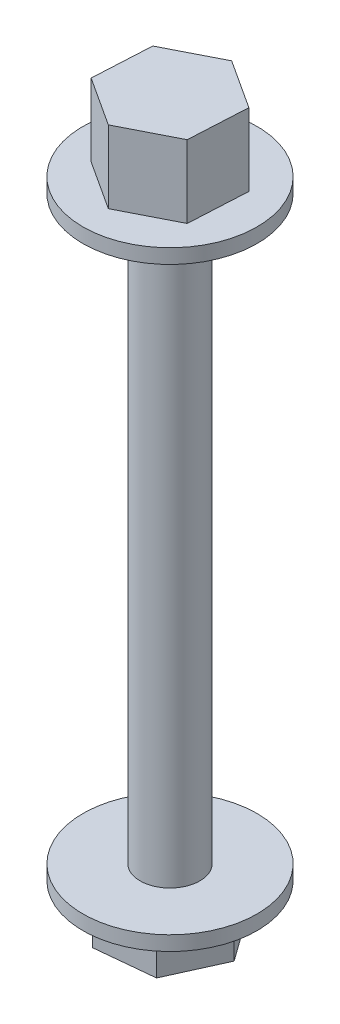
ISO-10303-21;
HEADER;
FILE_DESCRIPTION(('STEP AP214'),'2;1');
FILE_NAME('part.step','',(''),(''),'','','');
FILE_SCHEMA(('AUTOMOTIVE_DESIGN { 1 0 10303 214 1 1 1 1 }'));
ENDSEC;
DATA;
#1=APPLICATION_CONTEXT('core data for automotive mechanical design processes');
#2=APPLICATION_PROTOCOL_DEFINITION('international standard','automotive_design',2000,#1);
#3=PRODUCT_CONTEXT('',#1,'mechanical');
#4=PRODUCT('Part','Part','',(#3));
#5=PRODUCT_RELATED_PRODUCT_CATEGORY('part','',(#4));
#6=PRODUCT_DEFINITION_FORMATION('','',#4);
#7=PRODUCT_DEFINITION_CONTEXT('part definition',#1,'design');
#8=PRODUCT_DEFINITION('design','',#6,#7);
#9=PRODUCT_DEFINITION_SHAPE('','',#8);
#10=(LENGTH_UNIT() NAMED_UNIT(*) SI_UNIT(.MILLI.,.METRE.));
#11=(NAMED_UNIT(*) PLANE_ANGLE_UNIT() SI_UNIT($,.RADIAN.));
#12=(NAMED_UNIT(*) SI_UNIT($,.STERADIAN.) SOLID_ANGLE_UNIT());
#13=UNCERTAINTY_MEASURE_WITH_UNIT(LENGTH_MEASURE(1.E-05),#10,'distance_accuracy_value','');
#14=(GEOMETRIC_REPRESENTATION_CONTEXT(3) GLOBAL_UNCERTAINTY_ASSIGNED_CONTEXT((#13)) GLOBAL_UNIT_ASSIGNED_CONTEXT((#10,
#11,#12)) REPRESENTATION_CONTEXT('',''));
#15=CARTESIAN_POINT('',(0.,0.,0.));
#16=DIRECTION('',(0.,0.,1.));
#17=DIRECTION('',(1.,0.,0.));
#18=AXIS2_PLACEMENT_3D('',#15,#16,#17);
#19=CARTESIAN_POINT('',(0.,63.5,0.));
#20=DIRECTION('',(0.,-1.,0.));
#21=DIRECTION('',(0.,0.,-1.));
#22=AXIS2_PLACEMENT_3D('',#19,#20,#21);
#23=CYLINDRICAL_SURFACE('',#22,3.2639);
#24=CARTESIAN_POINT('',(0.,63.5,0.));
#25=DIRECTION('',(0.,1.,0.));
#26=DIRECTION('',(0.,0.,1.));
#27=AXIS2_PLACEMENT_3D('',#24,#25,#26);
#28=CIRCLE('',#27,3.2639);
#29=CARTESIAN_POINT('',(0.,63.5,3.2639));
#30=VERTEX_POINT('',#29);
#31=EDGE_CURVE('E11',#30,#30,#28,.T.);
#32=ORIENTED_EDGE('',*,*,#31,.F.);
#33=EDGE_LOOP('',(#32));
#34=FACE_BOUND('',#33,.T.);
#35=CARTESIAN_POINT('',(0.,0.,0.));
#36=DIRECTION('',(0.,1.,0.));
#37=DIRECTION('',(0.,0.,1.));
#38=AXIS2_PLACEMENT_3D('',#35,#36,#37);
#39=CIRCLE('',#38,3.2639);
#40=CARTESIAN_POINT('',(0.,0.,3.2639));
#41=VERTEX_POINT('',#40);
#42=EDGE_CURVE('E41',#41,#41,#39,.T.);
#43=ORIENTED_EDGE('',*,*,#42,.T.);
#44=EDGE_LOOP('',(#43));
#45=FACE_BOUND('',#44,.T.);
#46=ADVANCED_FACE('F38',(#34,#45),#23,.T.);
#47=CARTESIAN_POINT('',(0.,65.0875,0.));
#48=DIRECTION('',(0.,-1.,0.));
#49=DIRECTION('',(0.,0.,-1.));
#50=AXIS2_PLACEMENT_3D('',#47,#48,#49);
#51=CYLINDRICAL_SURFACE('',#50,9.525);
#52=CARTESIAN_POINT('',(0.,65.0875,0.));
#53=DIRECTION('',(0.,1.,0.));
#54=DIRECTION('',(0.,0.,1.));
#55=AXIS2_PLACEMENT_3D('',#52,#53,#54);
#56=CIRCLE('',#55,9.525);
#57=CARTESIAN_POINT('',(0.,65.0875,9.525));
#58=VERTEX_POINT('',#57);
#59=EDGE_CURVE('E46',#58,#58,#56,.T.);
#60=ORIENTED_EDGE('',*,*,#59,.F.);
#61=EDGE_LOOP('',(#60));
#62=FACE_BOUND('',#61,.T.);
#63=CARTESIAN_POINT('',(0.,63.5,0.));
#64=DIRECTION('',(0.,1.,0.));
#65=DIRECTION('',(0.,0.,1.));
#66=AXIS2_PLACEMENT_3D('',#63,#64,#65);
#67=CIRCLE('',#66,9.525);
#68=CARTESIAN_POINT('',(0.,63.5,9.525));
#69=VERTEX_POINT('',#68);
#70=EDGE_CURVE('E209',#69,#69,#67,.T.);
#71=ORIENTED_EDGE('',*,*,#70,.T.);
#72=EDGE_LOOP('',(#71));
#73=FACE_BOUND('',#72,.T.);
#74=ADVANCED_FACE('F242',(#62,#73),#51,.T.);
#75=CARTESIAN_POINT('',(0.,65.0875,0.));
#76=DIRECTION('',(0.,1.,0.));
#77=DIRECTION('',(0.,0.,1.));
#78=AXIS2_PLACEMENT_3D('',#75,#76,#77);
#79=PLANE('',#78);
#80=DIRECTION('',(0.891187187348243,0.,-0.453635753778653));
#81=VECTOR('',#80,1.);
#82=CARTESIAN_POINT('',(-0.338327889784957,65.0875,6.40687804802987));
#83=LINE('',#82,#81);
#84=CARTESIAN_POINT('',(-0.338327889784957,65.0875,6.40687804802987));
#85=VERTEX_POINT('',#84);
#86=CARTESIAN_POINT('',(5.37935520365024,65.0875,3.49643957137749));
#87=VERTEX_POINT('',#86);
#88=EDGE_CURVE('E53',#85,#87,#83,.T.);
#89=ORIENTED_EDGE('',*,*,#88,.F.);
#90=DIRECTION('',(0.838453680511338,0.,0.544972866881454));
#91=VECTOR('',#90,1.);
#92=CARTESIAN_POINT('',(-5.7176830934352,65.0875,2.91043847665238));
#93=LINE('',#92,#91);
#94=CARTESIAN_POINT('',(-5.7176830934352,65.0875,2.91043847665238));
#95=VERTEX_POINT('',#94);
#96=EDGE_CURVE('E57',#95,#85,#93,.T.);
#97=ORIENTED_EDGE('',*,*,#96,.F.);
#98=DIRECTION('',(-0.0527335068369052,0.,0.998608620660107));
#99=VECTOR('',#98,1.);
#100=CARTESIAN_POINT('',(-5.37935520365024,65.0875,-3.49643957137749));
#101=LINE('',#100,#99);
#102=CARTESIAN_POINT('',(-5.37935520365024,65.0875,-3.49643957137749));
#103=VERTEX_POINT('',#102);
#104=EDGE_CURVE('E420',#103,#95,#101,.T.);
#105=ORIENTED_EDGE('',*,*,#104,.F.);
#106=DIRECTION('',(-0.891187187348243,0.,0.453635753778653));
#107=VECTOR('',#106,1.);
#108=CARTESIAN_POINT('',(0.338327889784957,65.0875,-6.40687804802987));
#109=LINE('',#108,#107);
#110=CARTESIAN_POINT('',(0.338327889784957,65.0875,-6.40687804802987));
#111=VERTEX_POINT('',#110);
#112=EDGE_CURVE('E435',#111,#103,#109,.T.);
#113=ORIENTED_EDGE('',*,*,#112,.F.);
#114=DIRECTION('',(-0.838453680511338,0.,-0.544972866881454));
#115=VECTOR('',#114,1.);
#116=CARTESIAN_POINT('',(5.7176830934352,65.0875,-2.91043847665238));
#117=LINE('',#116,#115);
#118=CARTESIAN_POINT('',(5.7176830934352,65.0875,-2.91043847665238));
#119=VERTEX_POINT('',#118);
#120=EDGE_CURVE('E438',#119,#111,#117,.T.);
#121=ORIENTED_EDGE('',*,*,#120,.F.);
#122=DIRECTION('',(0.0527335068369049,0.,-0.998608620660107));
#123=VECTOR('',#122,1.);
#124=CARTESIAN_POINT('',(5.37935520365024,65.0875,3.49643957137749));
#125=LINE('',#124,#123);
#126=EDGE_CURVE('E439',#87,#119,#125,.T.);
#127=ORIENTED_EDGE('',*,*,#126,.F.);
#128=EDGE_LOOP('',(#89,#97,#105,#113,#121,#127));
#129=FACE_BOUND('',#128,.T.);
#130=ORIENTED_EDGE('',*,*,#59,.T.);
#131=EDGE_LOOP('',(#130));
#132=FACE_BOUND('',#131,.T.);
#133=ADVANCED_FACE('F236',(#129,#132),#79,.T.);
#134=CARTESIAN_POINT('',(0.,63.5,0.));
#135=DIRECTION('',(0.,1.,0.));
#136=DIRECTION('',(0.,0.,1.));
#137=AXIS2_PLACEMENT_3D('',#134,#135,#136);
#138=PLANE('',#137);
#139=ORIENTED_EDGE('',*,*,#31,.T.);
#140=EDGE_LOOP('',(#139));
#141=FACE_BOUND('',#140,.T.);
#142=ORIENTED_EDGE('',*,*,#70,.F.);
#143=EDGE_LOOP('',(#142));
#144=FACE_BOUND('',#143,.T.);
#145=ADVANCED_FACE('F227',(#141,#144),#138,.F.);
#146=CARTESIAN_POINT('',(0.,-1.5875,0.));
#147=DIRECTION('',(0.,1.,0.));
#148=DIRECTION('',(0.,0.,1.));
#149=AXIS2_PLACEMENT_3D('',#146,#147,#148);
#150=CYLINDRICAL_SURFACE('',#149,9.525);
#151=CARTESIAN_POINT('',(0.,-1.5875,0.));
#152=DIRECTION('',(0.,-1.,0.));
#153=DIRECTION('',(0.,0.,-1.));
#154=AXIS2_PLACEMENT_3D('',#151,#152,#153);
#155=CIRCLE('',#154,9.525);
#156=CARTESIAN_POINT('',(0.,-1.5875,-9.525));
#157=VERTEX_POINT('',#156);
#158=EDGE_CURVE('E202',#157,#157,#155,.T.);
#159=ORIENTED_EDGE('',*,*,#158,.F.);
#160=EDGE_LOOP('',(#159));
#161=FACE_BOUND('',#160,.T.);
#162=CARTESIAN_POINT('',(0.,0.,0.));
#163=DIRECTION('',(0.,-1.,0.));
#164=DIRECTION('',(0.,0.,-1.));
#165=AXIS2_PLACEMENT_3D('',#162,#163,#164);
#166=CIRCLE('',#165,9.525);
#167=CARTESIAN_POINT('',(0.,0.,-9.525));
#168=VERTEX_POINT('',#167);
#169=EDGE_CURVE('E201',#168,#168,#166,.T.);
#170=ORIENTED_EDGE('',*,*,#169,.T.);
#171=EDGE_LOOP('',(#170));
#172=FACE_BOUND('',#171,.T.);
#173=ADVANCED_FACE('F225',(#161,#172),#150,.T.);
#174=CARTESIAN_POINT('',(0.,-1.5875,0.));
#175=DIRECTION('',(0.,-1.,0.));
#176=DIRECTION('',(0.,0.,-1.));
#177=AXIS2_PLACEMENT_3D('',#174,#175,#176);
#178=PLANE('',#177);
#179=DIRECTION('',(-0.412217131805284,0.,0.91108563606624));
#180=VECTOR('',#179,1.);
#181=CARTESIAN_POINT('',(6.3845719055117,-1.5875,-0.632292390183559));
#182=LINE('',#181,#180);
#183=CARTESIAN_POINT('',(6.3845719055117,-1.5875,-0.632292390183559));
#184=VERTEX_POINT('',#183);
#185=CARTESIAN_POINT('',(3.73986722527439,-1.5875,5.21305526736977));
#186=VERTEX_POINT('',#185);
#187=EDGE_CURVE('E147',#184,#186,#182,.T.);
#188=ORIENTED_EDGE('',*,*,#187,.F.);
#189=DIRECTION('',(0.582914739953826,0.,0.812533326051654));
#190=VECTOR('',#189,1.);
#191=CARTESIAN_POINT('',(2.64470468023731,-1.5875,-5.84534765755333));
#192=LINE('',#191,#190);
#193=CARTESIAN_POINT('',(2.64470468023731,-1.5875,-5.84534765755333));
#194=VERTEX_POINT('',#193);
#195=EDGE_CURVE('E160',#194,#184,#192,.T.);
#196=ORIENTED_EDGE('',*,*,#195,.F.);
#197=DIRECTION('',(0.99513187175911,0.,-0.0985523100145861));
#198=VECTOR('',#197,1.);
#199=CARTESIAN_POINT('',(-3.73986722527439,-1.5875,-5.21305526736977));
#200=LINE('',#199,#198);
#201=CARTESIAN_POINT('',(-3.73986722527439,-1.5875,-5.21305526736977));
#202=VERTEX_POINT('',#201);
#203=EDGE_CURVE('E179',#202,#194,#200,.T.);
#204=ORIENTED_EDGE('',*,*,#203,.F.);
#205=DIRECTION('',(0.412217131805284,0.,-0.91108563606624));
#206=VECTOR('',#205,1.);
#207=CARTESIAN_POINT('',(-6.3845719055117,-1.5875,0.632292390183558));
#208=LINE('',#207,#206);
#209=CARTESIAN_POINT('',(-6.3845719055117,-1.5875,0.632292390183558));
#210=VERTEX_POINT('',#209);
#211=EDGE_CURVE('E176',#210,#202,#208,.T.);
#212=ORIENTED_EDGE('',*,*,#211,.F.);
#213=DIRECTION('',(-0.582914739953826,0.,-0.812533326051654));
#214=VECTOR('',#213,1.);
#215=CARTESIAN_POINT('',(-2.64470468023731,-1.5875,5.84534765755333));
#216=LINE('',#215,#214);
#217=CARTESIAN_POINT('',(-2.64470468023731,-1.5875,5.84534765755333));
#218=VERTEX_POINT('',#217);
#219=EDGE_CURVE('E173',#218,#210,#216,.T.);
#220=ORIENTED_EDGE('',*,*,#219,.F.);
#221=DIRECTION('',(-0.99513187175911,0.,0.0985523100145861));
#222=VECTOR('',#221,1.);
#223=CARTESIAN_POINT('',(3.73986722527439,-1.5875,5.21305526736977));
#224=LINE('',#223,#222);
#225=EDGE_CURVE('E150',#186,#218,#224,.T.);
#226=ORIENTED_EDGE('',*,*,#225,.F.);
#227=EDGE_LOOP('',(#188,#196,#204,#212,#220,#226));
#228=FACE_BOUND('',#227,.T.);
#229=ORIENTED_EDGE('',*,*,#158,.T.);
#230=EDGE_LOOP('',(#229));
#231=FACE_BOUND('',#230,.T.);
#232=ADVANCED_FACE('F221',(#228,#231),#178,.T.);
#233=CARTESIAN_POINT('',(0.,0.,0.));
#234=DIRECTION('',(0.,-1.,0.));
#235=DIRECTION('',(0.,0.,-1.));
#236=AXIS2_PLACEMENT_3D('',#233,#234,#235);
#237=PLANE('',#236);
#238=ORIENTED_EDGE('',*,*,#42,.F.);
#239=EDGE_LOOP('',(#238));
#240=FACE_BOUND('',#239,.T.);
#241=ORIENTED_EDGE('',*,*,#169,.F.);
#242=EDGE_LOOP('',(#241));
#243=FACE_BOUND('',#242,.T.);
#244=ADVANCED_FACE('F217',(#240,#243),#237,.F.);
#245=CARTESIAN_POINT('',(6.3845719055117,-6.35,-0.632292390183559));
#246=DIRECTION('',(-0.91108563606624,0.,-0.412217131805284));
#247=DIRECTION('',(-0.412217131805284,0.,0.91108563606624));
#248=AXIS2_PLACEMENT_3D('',#245,#246,#247);
#249=PLANE('',#248);
#250=ORIENTED_EDGE('',*,*,#187,.T.);
#251=DIRECTION('',(0.,1.,0.));
#252=VECTOR('',#251,1.);
#253=CARTESIAN_POINT('',(3.73986722527439,-6.35,5.21305526736977));
#254=LINE('',#253,#252);
#255=CARTESIAN_POINT('',(3.73986722527439,-6.35,5.21305526736977));
#256=VERTEX_POINT('',#255);
#257=EDGE_CURVE('E198',#256,#186,#254,.T.);
#258=ORIENTED_EDGE('',*,*,#257,.F.);
#259=DIRECTION('',(-0.412217131805284,0.,0.91108563606624));
#260=VECTOR('',#259,1.);
#261=CARTESIAN_POINT('',(6.3845719055117,-6.35,-0.632292390183559));
#262=LINE('',#261,#260);
#263=CARTESIAN_POINT('',(6.3845719055117,-6.35,-0.632292390183559));
#264=VERTEX_POINT('',#263);
#265=EDGE_CURVE('E156',#264,#256,#262,.T.);
#266=ORIENTED_EDGE('',*,*,#265,.F.);
#267=DIRECTION('',(0.,1.,0.));
#268=VECTOR('',#267,1.);
#269=CARTESIAN_POINT('',(6.3845719055117,-6.35,-0.632292390183559));
#270=LINE('',#269,#268);
#271=EDGE_CURVE('E169',#264,#184,#270,.T.);
#272=ORIENTED_EDGE('',*,*,#271,.T.);
#273=EDGE_LOOP('',(#250,#258,#266,#272));
#274=FACE_BOUND('',#273,.T.);
#275=ADVANCED_FACE('F220',(#274),#249,.F.);
#276=CARTESIAN_POINT('',(3.73986722527439,-6.35,5.21305526736977));
#277=DIRECTION('',(-0.0985523100145861,0.,-0.99513187175911));
#278=DIRECTION('',(-0.99513187175911,0.,0.0985523100145861));
#279=AXIS2_PLACEMENT_3D('',#276,#277,#278);
#280=PLANE('',#279);
#281=ORIENTED_EDGE('',*,*,#225,.T.);
#282=DIRECTION('',(0.,1.,0.));
#283=VECTOR('',#282,1.);
#284=CARTESIAN_POINT('',(-2.64470468023731,-6.35,5.84534765755333));
#285=LINE('',#284,#283);
#286=CARTESIAN_POINT('',(-2.64470468023731,-6.35,5.84534765755333));
#287=VERTEX_POINT('',#286);
#288=EDGE_CURVE('E195',#287,#218,#285,.T.);
#289=ORIENTED_EDGE('',*,*,#288,.F.);
#290=DIRECTION('',(-0.99513187175911,0.,0.0985523100145861));
#291=VECTOR('',#290,1.);
#292=CARTESIAN_POINT('',(3.73986722527439,-6.35,5.21305526736977));
#293=LINE('',#292,#291);
#294=EDGE_CURVE('E159',#256,#287,#293,.T.);
#295=ORIENTED_EDGE('',*,*,#294,.F.);
#296=ORIENTED_EDGE('',*,*,#257,.T.);
#297=EDGE_LOOP('',(#281,#289,#295,#296));
#298=FACE_BOUND('',#297,.T.);
#299=ADVANCED_FACE('F290',(#298),#280,.F.);
#300=CARTESIAN_POINT('',(-2.64470468023731,-6.35,5.84534765755333));
#301=DIRECTION('',(0.812533326051654,0.,-0.582914739953826));
#302=DIRECTION('',(-0.582914739953826,0.,-0.812533326051654));
#303=AXIS2_PLACEMENT_3D('',#300,#301,#302);
#304=PLANE('',#303);
#305=ORIENTED_EDGE('',*,*,#219,.T.);
#306=DIRECTION('',(0.,1.,0.));
#307=VECTOR('',#306,1.);
#308=CARTESIAN_POINT('',(-6.3845719055117,-6.35,0.632292390183558));
#309=LINE('',#308,#307);
#310=CARTESIAN_POINT('',(-6.3845719055117,-6.35,0.632292390183558));
#311=VERTEX_POINT('',#310);
#312=EDGE_CURVE('E192',#311,#210,#309,.T.);
#313=ORIENTED_EDGE('',*,*,#312,.F.);
#314=DIRECTION('',(-0.582914739953826,0.,-0.812533326051654));
#315=VECTOR('',#314,1.);
#316=CARTESIAN_POINT('',(-2.64470468023731,-6.35,5.84534765755333));
#317=LINE('',#316,#315);
#318=EDGE_CURVE('E162',#287,#311,#317,.T.);
#319=ORIENTED_EDGE('',*,*,#318,.F.);
#320=ORIENTED_EDGE('',*,*,#288,.T.);
#321=EDGE_LOOP('',(#305,#313,#319,#320));
#322=FACE_BOUND('',#321,.T.);
#323=ADVANCED_FACE('F300',(#322),#304,.F.);
#324=CARTESIAN_POINT('',(-6.3845719055117,-6.35,0.632292390183558));
#325=DIRECTION('',(0.91108563606624,0.,0.412217131805284));
#326=DIRECTION('',(0.412217131805284,0.,-0.91108563606624));
#327=AXIS2_PLACEMENT_3D('',#324,#325,#326);
#328=PLANE('',#327);
#329=ORIENTED_EDGE('',*,*,#211,.T.);
#330=DIRECTION('',(0.,1.,0.));
#331=VECTOR('',#330,1.);
#332=CARTESIAN_POINT('',(-3.73986722527439,-6.35,-5.21305526736977));
#333=LINE('',#332,#331);
#334=CARTESIAN_POINT('',(-3.73986722527439,-6.35,-5.21305526736977));
#335=VERTEX_POINT('',#334);
#336=EDGE_CURVE('E189',#335,#202,#333,.T.);
#337=ORIENTED_EDGE('',*,*,#336,.F.);
#338=DIRECTION('',(0.412217131805284,0.,-0.91108563606624));
#339=VECTOR('',#338,1.);
#340=CARTESIAN_POINT('',(-6.3845719055117,-6.35,0.632292390183558));
#341=LINE('',#340,#339);
#342=EDGE_CURVE('E164',#311,#335,#341,.T.);
#343=ORIENTED_EDGE('',*,*,#342,.F.);
#344=ORIENTED_EDGE('',*,*,#312,.T.);
#345=EDGE_LOOP('',(#329,#337,#343,#344));
#346=FACE_BOUND('',#345,.T.);
#347=ADVANCED_FACE('F310',(#346),#328,.F.);
#348=CARTESIAN_POINT('',(-3.73986722527439,-6.35,-5.21305526736977));
#349=DIRECTION('',(0.0985523100145861,0.,0.99513187175911));
#350=DIRECTION('',(0.99513187175911,0.,-0.0985523100145861));
#351=AXIS2_PLACEMENT_3D('',#348,#349,#350);
#352=PLANE('',#351);
#353=ORIENTED_EDGE('',*,*,#203,.T.);
#354=DIRECTION('',(0.,1.,0.));
#355=VECTOR('',#354,1.);
#356=CARTESIAN_POINT('',(2.64470468023731,-6.35,-5.84534765755333));
#357=LINE('',#356,#355);
#358=CARTESIAN_POINT('',(2.64470468023731,-6.35,-5.84534765755333));
#359=VERTEX_POINT('',#358);
#360=EDGE_CURVE('E186',#359,#194,#357,.T.);
#361=ORIENTED_EDGE('',*,*,#360,.F.);
#362=DIRECTION('',(0.99513187175911,0.,-0.0985523100145861));
#363=VECTOR('',#362,1.);
#364=CARTESIAN_POINT('',(-3.73986722527439,-6.35,-5.21305526736977));
#365=LINE('',#364,#363);
#366=EDGE_CURVE('E166',#335,#359,#365,.T.);
#367=ORIENTED_EDGE('',*,*,#366,.F.);
#368=ORIENTED_EDGE('',*,*,#336,.T.);
#369=EDGE_LOOP('',(#353,#361,#367,#368));
#370=FACE_BOUND('',#369,.T.);
#371=ADVANCED_FACE('F320',(#370),#352,.F.);
#372=CARTESIAN_POINT('',(2.64470468023731,-6.35,-5.84534765755333));
#373=DIRECTION('',(-0.812533326051654,0.,0.582914739953826));
#374=DIRECTION('',(0.582914739953826,0.,0.812533326051654));
#375=AXIS2_PLACEMENT_3D('',#372,#373,#374);
#376=PLANE('',#375);
#377=ORIENTED_EDGE('',*,*,#195,.T.);
#378=ORIENTED_EDGE('',*,*,#271,.F.);
#379=DIRECTION('',(0.582914739953826,0.,0.812533326051654));
#380=VECTOR('',#379,1.);
#381=CARTESIAN_POINT('',(2.64470468023731,-6.35,-5.84534765755333));
#382=LINE('',#381,#380);
#383=EDGE_CURVE('E168',#359,#264,#382,.T.);
#384=ORIENTED_EDGE('',*,*,#383,.F.);
#385=ORIENTED_EDGE('',*,*,#360,.T.);
#386=EDGE_LOOP('',(#377,#378,#384,#385));
#387=FACE_BOUND('',#386,.T.);
#388=ADVANCED_FACE('F330',(#387),#376,.F.);
#389=CARTESIAN_POINT('',(0.,-6.35,0.));
#390=DIRECTION('',(0.,-1.,0.));
#391=DIRECTION('',(0.,0.,-1.));
#392=AXIS2_PLACEMENT_3D('',#389,#390,#391);
#393=PLANE('',#392);
#394=ORIENTED_EDGE('',*,*,#265,.T.);
#395=ORIENTED_EDGE('',*,*,#294,.T.);
#396=ORIENTED_EDGE('',*,*,#318,.T.);
#397=ORIENTED_EDGE('',*,*,#342,.T.);
#398=ORIENTED_EDGE('',*,*,#366,.T.);
#399=ORIENTED_EDGE('',*,*,#383,.T.);
#400=EDGE_LOOP('',(#394,#395,#396,#397,#398,#399));
#401=FACE_BOUND('',#400,.T.);
#402=ADVANCED_FACE('F339',(#401),#393,.T.);
#403=CARTESIAN_POINT('',(-0.338327889784957,73.025,6.40687804802987));
#404=DIRECTION('',(-0.453635753778653,0.,-0.891187187348243));
#405=DIRECTION('',(-0.891187187348243,0.,0.453635753778654));
#406=AXIS2_PLACEMENT_3D('',#403,#404,#405);
#407=PLANE('',#406);
#408=ORIENTED_EDGE('',*,*,#88,.T.);
#409=DIRECTION('',(0.,-1.,0.));
#410=VECTOR('',#409,1.);
#411=CARTESIAN_POINT('',(5.37935520365024,73.025,3.49643957137749));
#412=LINE('',#411,#410);
#413=CARTESIAN_POINT('',(5.37935520365024,73.025,3.49643957137749));
#414=VERTEX_POINT('',#413);
#415=EDGE_CURVE('E130',#414,#87,#412,.T.);
#416=ORIENTED_EDGE('',*,*,#415,.F.);
#417=DIRECTION('',(0.891187187348243,0.,-0.453635753778653));
#418=VECTOR('',#417,1.);
#419=CARTESIAN_POINT('',(-0.338327889784957,73.025,6.40687804802987));
#420=LINE('',#419,#418);
#421=CARTESIAN_POINT('',(-0.338327889784957,73.025,6.40687804802987));
#422=VERTEX_POINT('',#421);
#423=EDGE_CURVE('E136',#422,#414,#420,.T.);
#424=ORIENTED_EDGE('',*,*,#423,.F.);
#425=DIRECTION('',(0.,-1.,0.));
#426=VECTOR('',#425,1.);
#427=CARTESIAN_POINT('',(-0.338327889784957,73.025,6.40687804802987));
#428=LINE('',#427,#426);
#429=EDGE_CURVE('E417',#422,#85,#428,.T.);
#430=ORIENTED_EDGE('',*,*,#429,.T.);
#431=EDGE_LOOP('',(#408,#416,#424,#430));
#432=FACE_BOUND('',#431,.T.);
#433=ADVANCED_FACE('F146',(#432),#407,.F.);
#434=CARTESIAN_POINT('',(5.37935520365024,73.025,3.49643957137749));
#435=DIRECTION('',(-0.998608620660107,0.,-0.0527335068369049));
#436=DIRECTION('',(-0.0527335068369049,0.,0.998608620660107));
#437=AXIS2_PLACEMENT_3D('',#434,#435,#436);
#438=PLANE('',#437);
#439=ORIENTED_EDGE('',*,*,#126,.T.);
#440=DIRECTION('',(0.,-1.,0.));
#441=VECTOR('',#440,1.);
#442=CARTESIAN_POINT('',(5.7176830934352,73.025,-2.91043847665238));
#443=LINE('',#442,#441);
#444=CARTESIAN_POINT('',(5.7176830934352,73.025,-2.91043847665238));
#445=VERTEX_POINT('',#444);
#446=EDGE_CURVE('E132',#445,#119,#443,.T.);
#447=ORIENTED_EDGE('',*,*,#446,.F.);
#448=DIRECTION('',(0.0527335068369049,0.,-0.998608620660107));
#449=VECTOR('',#448,1.);
#450=CARTESIAN_POINT('',(5.37935520365024,73.025,3.49643957137749));
#451=LINE('',#450,#449);
#452=EDGE_CURVE('E125',#414,#445,#451,.T.);
#453=ORIENTED_EDGE('',*,*,#452,.F.);
#454=ORIENTED_EDGE('',*,*,#415,.T.);
#455=EDGE_LOOP('',(#439,#447,#453,#454));
#456=FACE_BOUND('',#455,.T.);
#457=ADVANCED_FACE('F128',(#456),#438,.F.);
#458=CARTESIAN_POINT('',(5.7176830934352,73.025,-2.91043847665238));
#459=DIRECTION('',(-0.544972866881454,0.,0.838453680511338));
#460=DIRECTION('',(0.838453680511338,0.,0.544972866881454));
#461=AXIS2_PLACEMENT_3D('',#458,#459,#460);
#462=PLANE('',#461);
#463=ORIENTED_EDGE('',*,*,#120,.T.);
#464=DIRECTION('',(0.,-1.,0.));
#465=VECTOR('',#464,1.);
#466=CARTESIAN_POINT('',(0.338327889784957,73.025,-6.40687804802987));
#467=LINE('',#466,#465);
#468=CARTESIAN_POINT('',(0.338327889784957,73.025,-6.40687804802987));
#469=VERTEX_POINT('',#468);
#470=EDGE_CURVE('E152',#469,#111,#467,.T.);
#471=ORIENTED_EDGE('',*,*,#470,.F.);
#472=DIRECTION('',(-0.838453680511338,0.,-0.544972866881454));
#473=VECTOR('',#472,1.);
#474=CARTESIAN_POINT('',(5.7176830934352,73.025,-2.91043847665238));
#475=LINE('',#474,#473);
#476=EDGE_CURVE('E135',#445,#469,#475,.T.);
#477=ORIENTED_EDGE('',*,*,#476,.F.);
#478=ORIENTED_EDGE('',*,*,#446,.T.);
#479=EDGE_LOOP('',(#463,#471,#477,#478));
#480=FACE_BOUND('',#479,.T.);
#481=ADVANCED_FACE('F362',(#480),#462,.F.);
#482=CARTESIAN_POINT('',(0.338327889784957,73.025,-6.40687804802987));
#483=DIRECTION('',(0.453635753778653,0.,0.891187187348243));
#484=DIRECTION('',(0.891187187348244,0.,-0.453635753778653));
#485=AXIS2_PLACEMENT_3D('',#482,#483,#484);
#486=PLANE('',#485);
#487=ORIENTED_EDGE('',*,*,#112,.T.);
#488=DIRECTION('',(0.,-1.,0.));
#489=VECTOR('',#488,1.);
#490=CARTESIAN_POINT('',(-5.37935520365024,73.025,-3.49643957137749));
#491=LINE('',#490,#489);
#492=CARTESIAN_POINT('',(-5.37935520365024,73.025,-3.49643957137749));
#493=VERTEX_POINT('',#492);
#494=EDGE_CURVE('E423',#493,#103,#491,.T.);
#495=ORIENTED_EDGE('',*,*,#494,.F.);
#496=DIRECTION('',(-0.891187187348243,0.,0.453635753778653));
#497=VECTOR('',#496,1.);
#498=CARTESIAN_POINT('',(0.338327889784957,73.025,-6.40687804802987));
#499=LINE('',#498,#497);
#500=EDGE_CURVE('E436',#469,#493,#499,.T.);
#501=ORIENTED_EDGE('',*,*,#500,.F.);
#502=ORIENTED_EDGE('',*,*,#470,.T.);
#503=EDGE_LOOP('',(#487,#495,#501,#502));
#504=FACE_BOUND('',#503,.T.);
#505=ADVANCED_FACE('F369',(#504),#486,.F.);
#506=CARTESIAN_POINT('',(-5.37935520365024,73.025,-3.49643957137749));
#507=DIRECTION('',(0.998608620660107,0.,0.0527335068369052));
#508=DIRECTION('',(0.0527335068369052,0.,-0.998608620660107));
#509=AXIS2_PLACEMENT_3D('',#506,#507,#508);
#510=PLANE('',#509);
#511=ORIENTED_EDGE('',*,*,#104,.T.);
#512=DIRECTION('',(0.,-1.,0.));
#513=VECTOR('',#512,1.);
#514=CARTESIAN_POINT('',(-5.7176830934352,73.025,2.91043847665238));
#515=LINE('',#514,#513);
#516=CARTESIAN_POINT('',(-5.7176830934352,73.025,2.91043847665238));
#517=VERTEX_POINT('',#516);
#518=EDGE_CURVE('E419',#517,#95,#515,.T.);
#519=ORIENTED_EDGE('',*,*,#518,.F.);
#520=DIRECTION('',(-0.0527335068369052,0.,0.998608620660107));
#521=VECTOR('',#520,1.);
#522=CARTESIAN_POINT('',(-5.37935520365024,73.025,-3.49643957137749));
#523=LINE('',#522,#521);
#524=EDGE_CURVE('E425',#493,#517,#523,.T.);
#525=ORIENTED_EDGE('',*,*,#524,.F.);
#526=ORIENTED_EDGE('',*,*,#494,.T.);
#527=EDGE_LOOP('',(#511,#519,#525,#526));
#528=FACE_BOUND('',#527,.T.);
#529=ADVANCED_FACE('F377',(#528),#510,.F.);
#530=CARTESIAN_POINT('',(-5.7176830934352,73.025,2.91043847665238));
#531=DIRECTION('',(0.544972866881454,0.,-0.838453680511338));
#532=DIRECTION('',(-0.838453680511338,0.,-0.544972866881454));
#533=AXIS2_PLACEMENT_3D('',#530,#531,#532);
#534=PLANE('',#533);
#535=ORIENTED_EDGE('',*,*,#96,.T.);
#536=ORIENTED_EDGE('',*,*,#429,.F.);
#537=DIRECTION('',(0.838453680511338,0.,0.544972866881454));
#538=VECTOR('',#537,1.);
#539=CARTESIAN_POINT('',(-5.7176830934352,73.025,2.91043847665238));
#540=LINE('',#539,#538);
#541=EDGE_CURVE('E141',#517,#422,#540,.T.);
#542=ORIENTED_EDGE('',*,*,#541,.F.);
#543=ORIENTED_EDGE('',*,*,#518,.T.);
#544=EDGE_LOOP('',(#535,#536,#542,#543));
#545=FACE_BOUND('',#544,.T.);
#546=ADVANCED_FACE('F385',(#545),#534,.F.);
#547=CARTESIAN_POINT('',(0.,73.025,0.));
#548=DIRECTION('',(0.,1.,0.));
#549=DIRECTION('',(0.,0.,1.));
#550=AXIS2_PLACEMENT_3D('',#547,#548,#549);
#551=PLANE('',#550);
#552=ORIENTED_EDGE('',*,*,#423,.T.);
#553=ORIENTED_EDGE('',*,*,#452,.T.);
#554=ORIENTED_EDGE('',*,*,#476,.T.);
#555=ORIENTED_EDGE('',*,*,#500,.T.);
#556=ORIENTED_EDGE('',*,*,#524,.T.);
#557=ORIENTED_EDGE('',*,*,#541,.T.);
#558=EDGE_LOOP('',(#552,#553,#554,#555,#556,#557));
#559=FACE_BOUND('',#558,.T.);
#560=ADVANCED_FACE('F139',(#559),#551,.T.);
#561=CLOSED_SHELL('',(#46,#74,#133,#145,#173,#232,#244,#275,#299,#323,#347,#371,#388,#402,#433,
#457,#481,#505,#529,#546,#560));
#562=MANIFOLD_SOLID_BREP('B2',#561);
#563=ADVANCED_BREP_SHAPE_REPRESENTATION('',(#18,#562),#14);
#564=SHAPE_DEFINITION_REPRESENTATION(#9,#563);
ENDSEC;
END-ISO-10303-21;
